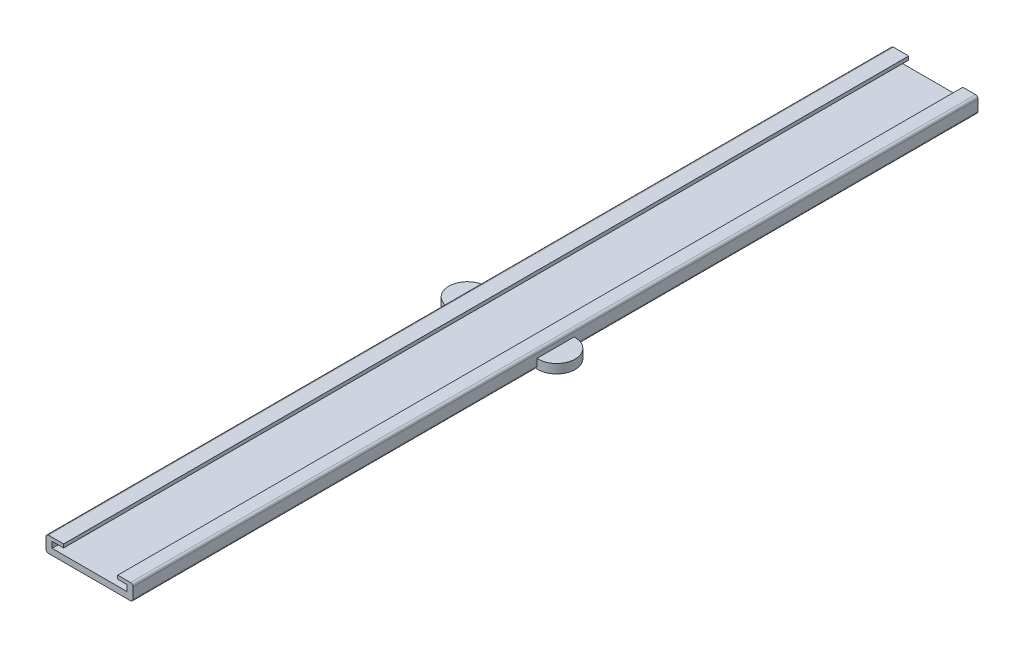
ISO-10303-21;
HEADER;
FILE_DESCRIPTION(('STEP AP214'),'2;1');
FILE_NAME('part.step','',(''),(''),'','','');
FILE_SCHEMA(('AUTOMOTIVE_DESIGN { 1 0 10303 214 1 1 1 1 }'));
ENDSEC;
DATA;
#1=APPLICATION_CONTEXT('core data for automotive mechanical design processes');
#2=APPLICATION_PROTOCOL_DEFINITION('international standard','automotive_design',2000,#1);
#3=PRODUCT_CONTEXT('',#1,'mechanical');
#4=PRODUCT('Part','Part','',(#3));
#5=PRODUCT_RELATED_PRODUCT_CATEGORY('part','',(#4));
#6=PRODUCT_DEFINITION_FORMATION('','',#4);
#7=PRODUCT_DEFINITION_CONTEXT('part definition',#1,'design');
#8=PRODUCT_DEFINITION('design','',#6,#7);
#9=PRODUCT_DEFINITION_SHAPE('','',#8);
#10=(LENGTH_UNIT() NAMED_UNIT(*) SI_UNIT(.MILLI.,.METRE.));
#11=(NAMED_UNIT(*) PLANE_ANGLE_UNIT() SI_UNIT($,.RADIAN.));
#12=(NAMED_UNIT(*) SI_UNIT($,.STERADIAN.) SOLID_ANGLE_UNIT());
#13=UNCERTAINTY_MEASURE_WITH_UNIT(LENGTH_MEASURE(1.E-05),#10,'distance_accuracy_value','');
#14=(GEOMETRIC_REPRESENTATION_CONTEXT(3) GLOBAL_UNCERTAINTY_ASSIGNED_CONTEXT((#13)) GLOBAL_UNIT_ASSIGNED_CONTEXT((#10,
#11,#12)) REPRESENTATION_CONTEXT('',''));
#15=CARTESIAN_POINT('',(0.,0.,0.));
#16=DIRECTION('',(0.,0.,1.));
#17=DIRECTION('',(1.,0.,0.));
#18=AXIS2_PLACEMENT_3D('',#15,#16,#17);
#19=CARTESIAN_POINT('',(-8.5725,0.508000000000008,-176.53));
#20=DIRECTION('',(0.,0.,1.));
#21=DIRECTION('',(1.,0.,0.));
#22=AXIS2_PLACEMENT_3D('',#19,#20,#21);
#23=CYLINDRICAL_SURFACE('',#22,0.508);
#24=CARTESIAN_POINT('',(-8.5725,0.,-84.455));
#25=CARTESIAN_POINT('',(-8.60085601750361,-2.57363729660605E-05,-84.4494803566917));
#26=CARTESIAN_POINT('',(-8.62928075324016,0.00237318987759572,-84.4443009230305));
#27=CARTESIAN_POINT('',(-8.68544702799154,0.0119040517791768,-84.4346899525163));
#28=CARTESIAN_POINT('',(-8.71318874184507,0.019034762853893,-84.4302582225313));
#29=CARTESIAN_POINT('',(-8.76721096384297,0.0379224635732551,-84.4222031700812));
#30=CARTESIAN_POINT('',(-8.79348997663773,0.0496840918321696,-84.4185806639051));
#31=CARTESIAN_POINT('',(-8.84374859544451,0.0775205499635421,-84.4121340674472));
#32=CARTESIAN_POINT('',(-8.86772915073191,0.0935935886905984,-84.4093096466046));
#33=CARTESIAN_POINT('',(-8.91240699002651,0.129400617523507,-84.404419715912));
#34=CARTESIAN_POINT('',(-8.9331391302894,0.149089982047235,-84.4023457834776));
#35=CARTESIAN_POINT('',(-8.97103758556271,0.191701373107937,-84.3988116410205));
#36=CARTESIAN_POINT('',(-8.9882030543511,0.214624164641076,-84.397351576559));
#37=CARTESIAN_POINT('',(-9.01839309631914,0.262944704366066,-84.3949392911666));
#38=CARTESIAN_POINT('',(-9.0314338201598,0.288332277738446,-84.3939850793579));
#39=CARTESIAN_POINT('',(-9.05308403224343,0.340934990054207,-84.3924741392716));
#40=CARTESIAN_POINT('',(-9.0616961075386,0.368149051502165,-84.3919171788606));
#41=CARTESIAN_POINT('',(-9.07213488865569,0.414269860246629,-84.3912583819337));
#42=CARTESIAN_POINT('',(-9.07526976471144,0.432889921611696,-84.3910664573951));
#43=CARTESIAN_POINT('',(-9.0794521411264,0.470337421251989,-84.3908134968995));
#44=CARTESIAN_POINT('',(-9.08050255915455,0.489164532518518,-84.3907522779813));
#45=CARTESIAN_POINT('',(-9.0805,0.508000000000008,-84.3907507825649));
#46=B_SPLINE_CURVE_WITH_KNOTS('',3,(#24,#25,#26,#27,#28,#29,#30,#31,#32,#33,#34,#35,#36,#37,#38,
#39,#40,#41,#42,#43,#44,#45),.UNSPECIFIED.,.F.,.F.,(4,2,2,2,2,2,2,2,2,2,4),(0.,
0.0865671762193437,0.173111957762147,0.25974364937724,0.34633940605287,0.431930743014866,
0.517542364093426,0.602814495073263,0.688036756488799,0.744576722813288,0.801037492728107),.UNSPECIFIED.);
#47=CARTESIAN_POINT('',(-8.57250000000001,0.,-84.455));
#48=VERTEX_POINT('',#47);
#49=CARTESIAN_POINT('',(-9.0805,0.508000000000008,-84.3907507825649));
#50=VERTEX_POINT('',#49);
#51=EDGE_CURVE('E199',#48,#50,#46,.T.);
#52=ORIENTED_EDGE('',*,*,#51,.F.);
#53=DIRECTION('',(0.,0.,1.));
#54=VECTOR('',#53,1.);
#55=CARTESIAN_POINT('',(-8.5725,0.,-176.53));
#56=LINE('',#55,#54);
#57=CARTESIAN_POINT('',(-8.5725,0.,0.));
#58=VERTEX_POINT('',#57);
#59=EDGE_CURVE('E209',#48,#58,#56,.T.);
#60=ORIENTED_EDGE('',*,*,#59,.T.);
#61=CARTESIAN_POINT('',(-8.5725,0.508000000000008,0.));
#62=DIRECTION('',(0.,0.,1.));
#63=DIRECTION('',(-1.,0.,0.));
#64=AXIS2_PLACEMENT_3D('',#61,#62,#63);
#65=CIRCLE('',#64,0.508);
#66=CARTESIAN_POINT('',(-9.0805,0.508000000000008,0.));
#67=VERTEX_POINT('',#66);
#68=EDGE_CURVE('E339',#67,#58,#65,.T.);
#69=ORIENTED_EDGE('',*,*,#68,.F.);
#70=DIRECTION('',(0.,0.,1.));
#71=VECTOR('',#70,1.);
#72=CARTESIAN_POINT('',(-9.0805,0.508000000000008,-176.53));
#73=LINE('',#72,#71);
#74=EDGE_CURVE('E211',#50,#67,#73,.T.);
#75=ORIENTED_EDGE('',*,*,#74,.F.);
#76=EDGE_LOOP('',(#52,#60,#69,#75));
#77=FACE_BOUND('',#76,.T.);
#78=ADVANCED_FACE('F49',(#77),#23,.T.);
#79=CARTESIAN_POINT('',(9.0805,0.508000000000008,-176.53));
#80=DIRECTION('',(1.,0.,0.));
#81=DIRECTION('',(0.,0.,-1.));
#82=AXIS2_PLACEMENT_3D('',#79,#80,#81);
#83=PLANE('',#82);
#84=DIRECTION('',(0.,0.,1.));
#85=VECTOR('',#84,1.);
#86=CARTESIAN_POINT('',(9.0805,0.508000000000008,-176.53));
#87=LINE('',#86,#85);
#88=CARTESIAN_POINT('',(9.0805,0.508000000000008,-84.3907507825649));
#89=VERTEX_POINT('',#88);
#90=CARTESIAN_POINT('',(9.0805,0.508000000000008,0.));
#91=VERTEX_POINT('',#90);
#92=EDGE_CURVE('E381',#89,#91,#87,.T.);
#93=ORIENTED_EDGE('',*,*,#92,.F.);
#94=DIRECTION('',(0.,-1.,0.));
#95=VECTOR('',#94,1.);
#96=CARTESIAN_POINT('',(9.0805,1.90499999999999,-84.3907507825649));
#97=LINE('',#96,#95);
#98=CARTESIAN_POINT('',(9.0805,1.90499999999999,-84.3907507825649));
#99=VERTEX_POINT('',#98);
#100=EDGE_CURVE('E422',#89,#99,#97,.F.);
#101=ORIENTED_EDGE('',*,*,#100,.T.);
#102=DIRECTION('',(0.,0.,-1.));
#103=VECTOR('',#102,1.);
#104=CARTESIAN_POINT('',(9.0805,1.90499999999999,-176.53));
#105=LINE('',#104,#103);
#106=CARTESIAN_POINT('',(9.0805,1.90499999999999,-92.1392492174351));
#107=VERTEX_POINT('',#106);
#108=EDGE_CURVE('E238',#99,#107,#105,.T.);
#109=ORIENTED_EDGE('',*,*,#108,.T.);
#110=DIRECTION('',(0.,-1.,0.));
#111=VECTOR('',#110,1.);
#112=CARTESIAN_POINT('',(9.0805,1.90499999999999,-92.1392492174351));
#113=LINE('',#112,#111);
#114=CARTESIAN_POINT('',(9.0805,0.508000000000008,-92.1392492174351));
#115=VERTEX_POINT('',#114);
#116=EDGE_CURVE('E324',#107,#115,#113,.T.);
#117=ORIENTED_EDGE('',*,*,#116,.T.);
#118=CARTESIAN_POINT('',(9.0805,0.508000000000008,-176.53));
#119=VERTEX_POINT('',#118);
#120=EDGE_CURVE('E379',#119,#115,#87,.T.);
#121=ORIENTED_EDGE('',*,*,#120,.F.);
#122=DIRECTION('',(0.,1.,0.));
#123=VECTOR('',#122,1.);
#124=CARTESIAN_POINT('',(9.0805,0.508000000000008,-176.53));
#125=LINE('',#124,#123);
#126=CARTESIAN_POINT('',(9.0805,2.79399999999999,-176.53));
#127=VERTEX_POINT('',#126);
#128=EDGE_CURVE('E300',#119,#127,#125,.T.);
#129=ORIENTED_EDGE('',*,*,#128,.T.);
#130=DIRECTION('',(0.,0.,1.));
#131=VECTOR('',#130,1.);
#132=CARTESIAN_POINT('',(9.0805,2.79399999999999,-176.53));
#133=LINE('',#132,#131);
#134=CARTESIAN_POINT('',(9.0805,2.79399999999999,0.));
#135=VERTEX_POINT('',#134);
#136=EDGE_CURVE('E378',#127,#135,#133,.T.);
#137=ORIENTED_EDGE('',*,*,#136,.T.);
#138=DIRECTION('',(0.,1.,0.));
#139=VECTOR('',#138,1.);
#140=CARTESIAN_POINT('',(9.0805,0.508000000000008,0.));
#141=LINE('',#140,#139);
#142=EDGE_CURVE('E345',#91,#135,#141,.T.);
#143=ORIENTED_EDGE('',*,*,#142,.F.);
#144=EDGE_LOOP('',(#93,#101,#109,#117,#121,#129,#137,#143));
#145=FACE_BOUND('',#144,.T.);
#146=ADVANCED_FACE('F256',(#145),#83,.T.);
#147=CARTESIAN_POINT('',(8.5725,0.508000000000008,-176.53));
#148=DIRECTION('',(0.,0.,1.));
#149=DIRECTION('',(1.,0.,0.));
#150=AXIS2_PLACEMENT_3D('',#147,#148,#149);
#151=CYLINDRICAL_SURFACE('',#150,0.508);
#152=ORIENTED_EDGE('',*,*,#120,.T.);
#153=CARTESIAN_POINT('',(9.0805,0.508000000000008,-92.1392492174351));
#154=CARTESIAN_POINT('',(9.08052454050856,0.47948709235608,-92.1392417212356));
#155=CARTESIAN_POINT('',(9.07810091401542,0.450981072385935,-92.139105443856));
#156=CARTESIAN_POINT('',(9.06853771388,0.394795340657186,-92.1385198869864));
#157=CARTESIAN_POINT('',(9.06140162670704,0.367115033814449,-92.1380708388833));
#158=CARTESIAN_POINT('',(9.0425886415355,0.31333516747899,-92.1368041333826));
#159=CARTESIAN_POINT('',(9.03090944614668,0.287236415487662,-92.1359862894564));
#160=CARTESIAN_POINT('',(9.00335951362613,0.237381129190595,-92.1338842053361));
#161=CARTESIAN_POINT('',(8.98748956231524,0.213624156916645,-92.132600052564));
#162=CARTESIAN_POINT('',(8.95203778634441,0.169144216635002,-92.1294573325824));
#163=CARTESIAN_POINT('',(8.9324595473146,0.148418351804164,-92.1275993191667));
#164=CARTESIAN_POINT('',(8.89015796761817,0.110554235591045,-92.1232036356471));
#165=CARTESIAN_POINT('',(8.86743429633976,0.0934163618136529,-92.1206658940717));
#166=CARTESIAN_POINT('',(8.81953459375239,0.0632084453451852,-92.1148354139104));
#167=CARTESIAN_POINT('',(8.79435982876638,0.0501363166334418,-92.1115430640041));
#168=CARTESIAN_POINT('',(8.74228943665466,0.0283846951320433,-92.1041700640766));
#169=CARTESIAN_POINT('',(8.71539435316314,0.0197038223205138,-92.1000896622708));
#170=CARTESIAN_POINT('',(8.66904804631985,0.00887712465885759,-92.0925354137435));
#171=CARTESIAN_POINT('',(8.64983257459497,0.0055450682170126,-92.0892570318643));
#172=CARTESIAN_POINT('',(8.61123666689856,0.00110666177209787,-92.0823698460991));
#173=CARTESIAN_POINT('',(8.59185654382364,-3.23850493928589E-06,-92.0787615789228));
#174=CARTESIAN_POINT('',(8.57250000000001,0.,-92.075));
#175=B_SPLINE_CURVE_WITH_KNOTS('',3,(#153,#154,#155,#156,#157,#158,#159,#160,#161,#162,#163,
#164,#165,#166,#167,#168,#169,#170,#171,#172,#173,#174),.UNSPECIFIED.,.F.,.F.,(4,2,2,2,2,2,2,2,
2,2,4),(0.,0.0854257775274036,0.170788424304943,0.256194294087832,0.341584160525399,
0.426891879145785,0.512208571154461,0.597481417055752,0.682727447936928,0.741933414736251,
0.801044714167535),.UNSPECIFIED.);
#176=CARTESIAN_POINT('',(8.57250000000001,0.,-92.075));
#177=VERTEX_POINT('',#176);
#178=EDGE_CURVE('E414',#115,#177,#175,.T.);
#179=ORIENTED_EDGE('',*,*,#178,.T.);
#180=DIRECTION('',(0.,0.,1.));
#181=VECTOR('',#180,1.);
#182=CARTESIAN_POINT('',(8.5725,0.,-176.53));
#183=LINE('',#182,#181);
#184=CARTESIAN_POINT('',(8.5725,0.,-176.53));
#185=VERTEX_POINT('',#184);
#186=EDGE_CURVE('E224',#185,#177,#183,.T.);
#187=ORIENTED_EDGE('',*,*,#186,.F.);
#188=CARTESIAN_POINT('',(8.5725,0.508000000000008,-176.53));
#189=DIRECTION('',(0.,0.,1.));
#190=DIRECTION('',(-1.,0.,0.));
#191=AXIS2_PLACEMENT_3D('',#188,#189,#190);
#192=CIRCLE('',#191,0.508);
#193=EDGE_CURVE('E297',#185,#119,#192,.T.);
#194=ORIENTED_EDGE('',*,*,#193,.T.);
#195=EDGE_LOOP('',(#152,#179,#187,#194));
#196=FACE_BOUND('',#195,.T.);
#197=ADVANCED_FACE('F262',(#196),#151,.T.);
#198=CARTESIAN_POINT('',(8.5725,0.,-84.455));
#199=VERTEX_POINT('',#198);
#200=CARTESIAN_POINT('',(8.5725,0.,0.));
#201=VERTEX_POINT('',#200);
#202=EDGE_CURVE('E220',#199,#201,#183,.T.);
#203=ORIENTED_EDGE('',*,*,#202,.F.);
#204=CARTESIAN_POINT('',(8.5725,0.,-84.455));
#205=CARTESIAN_POINT('',(8.60085601750361,-2.57363729660605E-05,-84.4494803566917));
#206=CARTESIAN_POINT('',(8.62928075324016,0.00237318987759572,-84.4443009230305));
#207=CARTESIAN_POINT('',(8.68544702799154,0.0119040517791768,-84.4346899525163));
#208=CARTESIAN_POINT('',(8.71318874184507,0.019034762853893,-84.4302582225313));
#209=CARTESIAN_POINT('',(8.76721096384297,0.0379224635732551,-84.4222031700812));
#210=CARTESIAN_POINT('',(8.79348997663773,0.0496840918321696,-84.4185806639051));
#211=CARTESIAN_POINT('',(8.84374859544451,0.0775205499635421,-84.4121340674472));
#212=CARTESIAN_POINT('',(8.86772915073191,0.0935935886905984,-84.4093096466046));
#213=CARTESIAN_POINT('',(8.91240699002651,0.129400617523507,-84.404419715912));
#214=CARTESIAN_POINT('',(8.9331391302894,0.149089982047235,-84.4023457834776));
#215=CARTESIAN_POINT('',(8.97103758556271,0.191701373107937,-84.3988116410205));
#216=CARTESIAN_POINT('',(8.9882030543511,0.214624164641076,-84.397351576559));
#217=CARTESIAN_POINT('',(9.01839309631914,0.262944704366066,-84.3949392911666));
#218=CARTESIAN_POINT('',(9.0314338201598,0.288332277738446,-84.3939850793579));
#219=CARTESIAN_POINT('',(9.05308403224343,0.340934990054207,-84.3924741392716));
#220=CARTESIAN_POINT('',(9.0616961075386,0.368149051502165,-84.3919171788606));
#221=CARTESIAN_POINT('',(9.07213488865569,0.414269860246629,-84.3912583819337));
#222=CARTESIAN_POINT('',(9.07526976471144,0.432889921611696,-84.3910664573951));
#223=CARTESIAN_POINT('',(9.0794521411264,0.470337421251989,-84.3908134968995));
#224=CARTESIAN_POINT('',(9.08050255915455,0.489164532518518,-84.3907522779813));
#225=CARTESIAN_POINT('',(9.0805,0.508000000000008,-84.3907507825649));
#226=B_SPLINE_CURVE_WITH_KNOTS('',3,(#204,#205,#206,#207,#208,#209,#210,#211,#212,#213,#214,
#215,#216,#217,#218,#219,#220,#221,#222,#223,#224,#225),.UNSPECIFIED.,.F.,.F.,(4,2,2,2,2,2,2,2,
2,2,4),(0.,0.0865671762193437,0.173111957762147,0.25974364937724,0.34633940605287,
0.431930743014866,0.517542364093426,0.602814495073263,0.688036756488799,0.744576722813288,
0.801037492728107),.UNSPECIFIED.);
#227=EDGE_CURVE('E433',#199,#89,#226,.T.);
#228=ORIENTED_EDGE('',*,*,#227,.T.);
#229=ORIENTED_EDGE('',*,*,#92,.T.);
#230=CARTESIAN_POINT('',(8.5725,0.508000000000008,0.));
#231=DIRECTION('',(0.,0.,1.));
#232=DIRECTION('',(-1.,0.,0.));
#233=AXIS2_PLACEMENT_3D('',#230,#231,#232);
#234=CIRCLE('',#233,0.508);
#235=EDGE_CURVE('E342',#201,#91,#234,.T.);
#236=ORIENTED_EDGE('',*,*,#235,.F.);
#237=EDGE_LOOP('',(#203,#228,#229,#236));
#238=FACE_BOUND('',#237,.T.);
#239=ADVANCED_FACE('F390',(#238),#151,.T.);
#240=CARTESIAN_POINT('',(-7.8105,2.5654,-176.53));
#241=DIRECTION('',(1.,0.,0.));
#242=DIRECTION('',(0.,0.,-1.));
#243=AXIS2_PLACEMENT_3D('',#240,#241,#242);
#244=PLANE('',#243);
#245=DIRECTION('',(0.,1.,0.));
#246=VECTOR('',#245,1.);
#247=CARTESIAN_POINT('',(-7.8105,2.5654,0.));
#248=LINE('',#247,#246);
#249=CARTESIAN_POINT('',(-7.8105,1.2954,0.));
#250=VERTEX_POINT('',#249);
#251=CARTESIAN_POINT('',(-7.8105,2.5654,0.));
#252=VERTEX_POINT('',#251);
#253=EDGE_CURVE('E320',#250,#252,#248,.T.);
#254=ORIENTED_EDGE('',*,*,#253,.F.);
#255=DIRECTION('',(0.,0.,1.));
#256=VECTOR('',#255,1.);
#257=CARTESIAN_POINT('',(-7.8105,1.2954,-176.53));
#258=LINE('',#257,#256);
#259=CARTESIAN_POINT('',(-7.8105,1.2954,-176.53));
#260=VERTEX_POINT('',#259);
#261=EDGE_CURVE('E242',#260,#250,#258,.T.);
#262=ORIENTED_EDGE('',*,*,#261,.F.);
#263=DIRECTION('',(0.,1.,0.));
#264=VECTOR('',#263,1.);
#265=CARTESIAN_POINT('',(-7.8105,2.5654,-176.53));
#266=LINE('',#265,#264);
#267=CARTESIAN_POINT('',(-7.8105,2.5654,-176.53));
#268=VERTEX_POINT('',#267);
#269=EDGE_CURVE('E366',#260,#268,#266,.T.);
#270=ORIENTED_EDGE('',*,*,#269,.T.);
#271=DIRECTION('',(0.,0.,1.));
#272=VECTOR('',#271,1.);
#273=CARTESIAN_POINT('',(-7.8105,2.5654,-176.53));
#274=LINE('',#273,#272);
#275=EDGE_CURVE('E235',#268,#252,#274,.T.);
#276=ORIENTED_EDGE('',*,*,#275,.T.);
#277=EDGE_LOOP('',(#254,#262,#270,#276));
#278=FACE_BOUND('',#277,.T.);
#279=ADVANCED_FACE('F51',(#278),#244,.T.);
#280=CARTESIAN_POINT('',(-7.8105,1.2954,-176.53));
#281=DIRECTION('',(0.,1.,0.));
#282=DIRECTION('',(0.,0.,1.));
#283=AXIS2_PLACEMENT_3D('',#280,#281,#282);
#284=PLANE('',#283);
#285=DIRECTION('',(-1.,0.,0.));
#286=VECTOR('',#285,1.);
#287=CARTESIAN_POINT('',(-7.8105,1.2954,0.));
#288=LINE('',#287,#286);
#289=CARTESIAN_POINT('',(7.8105,1.2954,0.));
#290=VERTEX_POINT('',#289);
#291=EDGE_CURVE('E363',#290,#250,#288,.T.);
#292=ORIENTED_EDGE('',*,*,#291,.F.);
#293=DIRECTION('',(0.,0.,1.));
#294=VECTOR('',#293,1.);
#295=CARTESIAN_POINT('',(7.8105,1.2954,-176.53));
#296=LINE('',#295,#294);
#297=CARTESIAN_POINT('',(7.8105,1.2954,-176.53));
#298=VERTEX_POINT('',#297);
#299=EDGE_CURVE('E368',#298,#290,#296,.T.);
#300=ORIENTED_EDGE('',*,*,#299,.F.);
#301=DIRECTION('',(-1.,0.,0.));
#302=VECTOR('',#301,1.);
#303=CARTESIAN_POINT('',(-7.8105,1.2954,-176.53));
#304=LINE('',#303,#302);
#305=EDGE_CURVE('E237',#298,#260,#304,.T.);
#306=ORIENTED_EDGE('',*,*,#305,.T.);
#307=ORIENTED_EDGE('',*,*,#261,.T.);
#308=EDGE_LOOP('',(#292,#300,#306,#307));
#309=FACE_BOUND('',#308,.T.);
#310=ADVANCED_FACE('F478',(#309),#284,.T.);
#311=CARTESIAN_POINT('',(7.8105,1.2954,-176.53));
#312=DIRECTION('',(-1.,0.,0.));
#313=DIRECTION('',(0.,-1.,0.));
#314=AXIS2_PLACEMENT_3D('',#311,#312,#313);
#315=PLANE('',#314);
#316=DIRECTION('',(0.,-1.,0.));
#317=VECTOR('',#316,1.);
#318=CARTESIAN_POINT('',(7.8105,1.2954,0.));
#319=LINE('',#318,#317);
#320=CARTESIAN_POINT('',(7.8105,2.5654,0.));
#321=VERTEX_POINT('',#320);
#322=EDGE_CURVE('E360',#321,#290,#319,.T.);
#323=ORIENTED_EDGE('',*,*,#322,.F.);
#324=DIRECTION('',(0.,0.,1.));
#325=VECTOR('',#324,1.);
#326=CARTESIAN_POINT('',(7.8105,2.5654,-176.53));
#327=LINE('',#326,#325);
#328=CARTESIAN_POINT('',(7.8105,2.5654,-176.53));
#329=VERTEX_POINT('',#328);
#330=EDGE_CURVE('E370',#329,#321,#327,.T.);
#331=ORIENTED_EDGE('',*,*,#330,.F.);
#332=DIRECTION('',(0.,-1.,0.));
#333=VECTOR('',#332,1.);
#334=CARTESIAN_POINT('',(7.8105,1.2954,-176.53));
#335=LINE('',#334,#333);
#336=EDGE_CURVE('E315',#329,#298,#335,.T.);
#337=ORIENTED_EDGE('',*,*,#336,.T.);
#338=ORIENTED_EDGE('',*,*,#299,.T.);
#339=EDGE_LOOP('',(#323,#331,#337,#338));
#340=FACE_BOUND('',#339,.T.);
#341=ADVANCED_FACE('F490',(#340),#315,.T.);
#342=CARTESIAN_POINT('',(5.9055,2.5654,-176.53));
#343=DIRECTION('',(0.,-1.,0.));
#344=DIRECTION('',(1.,0.,0.));
#345=AXIS2_PLACEMENT_3D('',#342,#343,#344);
#346=PLANE('',#345);
#347=DIRECTION('',(1.,0.,0.));
#348=VECTOR('',#347,1.);
#349=CARTESIAN_POINT('',(5.9055,2.5654,0.));
#350=LINE('',#349,#348);
#351=CARTESIAN_POINT('',(5.9055,2.5654,0.));
#352=VERTEX_POINT('',#351);
#353=EDGE_CURVE('E357',#352,#321,#350,.T.);
#354=ORIENTED_EDGE('',*,*,#353,.F.);
#355=DIRECTION('',(0.,0.,1.));
#356=VECTOR('',#355,1.);
#357=CARTESIAN_POINT('',(5.9055,2.5654,-176.53));
#358=LINE('',#357,#356);
#359=CARTESIAN_POINT('',(5.9055,2.5654,-176.53));
#360=VERTEX_POINT('',#359);
#361=EDGE_CURVE('E372',#360,#352,#358,.T.);
#362=ORIENTED_EDGE('',*,*,#361,.F.);
#363=DIRECTION('',(1.,0.,0.));
#364=VECTOR('',#363,1.);
#365=CARTESIAN_POINT('',(5.9055,2.5654,-176.53));
#366=LINE('',#365,#364);
#367=EDGE_CURVE('E312',#360,#329,#366,.T.);
#368=ORIENTED_EDGE('',*,*,#367,.T.);
#369=ORIENTED_EDGE('',*,*,#330,.T.);
#370=EDGE_LOOP('',(#354,#362,#368,#369));
#371=FACE_BOUND('',#370,.T.);
#372=ADVANCED_FACE('F473',(#371),#346,.T.);
#373=CARTESIAN_POINT('',(5.9055,3.302,-176.53));
#374=DIRECTION('',(-1.,0.,0.));
#375=DIRECTION('',(0.,-1.,0.));
#376=AXIS2_PLACEMENT_3D('',#373,#374,#375);
#377=PLANE('',#376);
#378=DIRECTION('',(0.,-1.,0.));
#379=VECTOR('',#378,1.);
#380=CARTESIAN_POINT('',(5.9055,3.302,0.));
#381=LINE('',#380,#379);
#382=CARTESIAN_POINT('',(5.9055,3.302,0.));
#383=VERTEX_POINT('',#382);
#384=EDGE_CURVE('E354',#383,#352,#381,.T.);
#385=ORIENTED_EDGE('',*,*,#384,.F.);
#386=DIRECTION('',(0.,0.,1.));
#387=VECTOR('',#386,1.);
#388=CARTESIAN_POINT('',(5.9055,3.302,-176.53));
#389=LINE('',#388,#387);
#390=CARTESIAN_POINT('',(5.9055,3.302,-176.53));
#391=VERTEX_POINT('',#390);
#392=EDGE_CURVE('E374',#391,#383,#389,.T.);
#393=ORIENTED_EDGE('',*,*,#392,.F.);
#394=DIRECTION('',(0.,-1.,0.));
#395=VECTOR('',#394,1.);
#396=CARTESIAN_POINT('',(5.9055,3.302,-176.53));
#397=LINE('',#396,#395);
#398=EDGE_CURVE('E309',#391,#360,#397,.T.);
#399=ORIENTED_EDGE('',*,*,#398,.T.);
#400=ORIENTED_EDGE('',*,*,#361,.T.);
#401=EDGE_LOOP('',(#385,#393,#399,#400));
#402=FACE_BOUND('',#401,.T.);
#403=ADVANCED_FACE('F469',(#402),#377,.T.);
#404=CARTESIAN_POINT('',(8.5725,3.302,-176.53));
#405=DIRECTION('',(0.,1.,0.));
#406=DIRECTION('',(0.,0.,1.));
#407=AXIS2_PLACEMENT_3D('',#404,#405,#406);
#408=PLANE('',#407);
#409=DIRECTION('',(-1.,0.,0.));
#410=VECTOR('',#409,1.);
#411=CARTESIAN_POINT('',(8.5725,3.302,0.));
#412=LINE('',#411,#410);
#413=CARTESIAN_POINT('',(8.5725,3.302,0.));
#414=VERTEX_POINT('',#413);
#415=EDGE_CURVE('E351',#414,#383,#412,.T.);
#416=ORIENTED_EDGE('',*,*,#415,.F.);
#417=DIRECTION('',(0.,0.,1.));
#418=VECTOR('',#417,1.);
#419=CARTESIAN_POINT('',(8.5725,3.302,-176.53));
#420=LINE('',#419,#418);
#421=CARTESIAN_POINT('',(8.5725,3.302,-176.53));
#422=VERTEX_POINT('',#421);
#423=EDGE_CURVE('E376',#422,#414,#420,.T.);
#424=ORIENTED_EDGE('',*,*,#423,.F.);
#425=DIRECTION('',(-1.,0.,0.));
#426=VECTOR('',#425,1.);
#427=CARTESIAN_POINT('',(8.5725,3.302,-176.53));
#428=LINE('',#427,#426);
#429=EDGE_CURVE('E306',#422,#391,#428,.T.);
#430=ORIENTED_EDGE('',*,*,#429,.T.);
#431=ORIENTED_EDGE('',*,*,#392,.T.);
#432=EDGE_LOOP('',(#416,#424,#430,#431));
#433=FACE_BOUND('',#432,.T.);
#434=ADVANCED_FACE('F466',(#433),#408,.T.);
#435=CARTESIAN_POINT('',(8.5725,2.79399999999999,-176.53));
#436=DIRECTION('',(0.,0.,1.));
#437=DIRECTION('',(1.,0.,0.));
#438=AXIS2_PLACEMENT_3D('',#435,#436,#437);
#439=CYLINDRICAL_SURFACE('',#438,0.508);
#440=CARTESIAN_POINT('',(8.5725,2.79399999999999,0.));
#441=DIRECTION('',(0.,0.,1.));
#442=DIRECTION('',(1.,0.,0.));
#443=AXIS2_PLACEMENT_3D('',#440,#441,#442);
#444=CIRCLE('',#443,0.508);
#445=EDGE_CURVE('E348',#135,#414,#444,.T.);
#446=ORIENTED_EDGE('',*,*,#445,.F.);
#447=ORIENTED_EDGE('',*,*,#136,.F.);
#448=CARTESIAN_POINT('',(8.5725,2.79399999999999,-176.53));
#449=DIRECTION('',(0.,0.,1.));
#450=DIRECTION('',(1.,0.,0.));
#451=AXIS2_PLACEMENT_3D('',#448,#449,#450);
#452=CIRCLE('',#451,0.508);
#453=EDGE_CURVE('E303',#127,#422,#452,.T.);
#454=ORIENTED_EDGE('',*,*,#453,.T.);
#455=ORIENTED_EDGE('',*,*,#423,.T.);
#456=EDGE_LOOP('',(#446,#447,#454,#455));
#457=FACE_BOUND('',#456,.T.);
#458=ADVANCED_FACE('F275',(#457),#439,.T.);
#459=CARTESIAN_POINT('',(-8.5725,0.,-176.53));
#460=DIRECTION('',(0.,-1.,0.));
#461=DIRECTION('',(1.,0.,0.));
#462=AXIS2_PLACEMENT_3D('',#459,#460,#461);
#463=PLANE('',#462);
#464=DIRECTION('',(1.,0.,0.));
#465=VECTOR('',#464,1.);
#466=CARTESIAN_POINT('',(-8.5725,0.,0.));
#467=LINE('',#466,#465);
#468=EDGE_CURVE('E215',#58,#201,#467,.T.);
#469=ORIENTED_EDGE('',*,*,#468,.F.);
#470=ORIENTED_EDGE('',*,*,#59,.F.);
#471=CARTESIAN_POINT('',(-9.31243208542951,0.,-88.265));
#472=DIRECTION('',(0.,-1.,0.));
#473=DIRECTION('',(0.,0.,-1.));
#474=AXIS2_PLACEMENT_3D('',#471,#472,#473);
#475=CIRCLE('',#474,3.88118532036902);
#476=CARTESIAN_POINT('',(-8.57250000000001,0.,-92.075));
#477=VERTEX_POINT('',#476);
#478=EDGE_CURVE('E196',#48,#477,#475,.T.);
#479=ORIENTED_EDGE('',*,*,#478,.T.);
#480=CARTESIAN_POINT('',(-8.5725,0.,-176.53));
#481=VERTEX_POINT('',#480);
#482=EDGE_CURVE('E217',#481,#477,#56,.T.);
#483=ORIENTED_EDGE('',*,*,#482,.F.);
#484=DIRECTION('',(1.,0.,0.));
#485=VECTOR('',#484,1.);
#486=CARTESIAN_POINT('',(-8.5725,0.,-176.53));
#487=LINE('',#486,#485);
#488=EDGE_CURVE('E289',#481,#185,#487,.T.);
#489=ORIENTED_EDGE('',*,*,#488,.T.);
#490=ORIENTED_EDGE('',*,*,#186,.T.);
#491=CARTESIAN_POINT('',(9.31243208542951,0.,-88.265));
#492=DIRECTION('',(0.,1.,0.));
#493=DIRECTION('',(0.,0.,-1.));
#494=AXIS2_PLACEMENT_3D('',#491,#492,#493);
#495=CIRCLE('',#494,3.88118532036902);
#496=EDGE_CURVE('E71',#199,#177,#495,.T.);
#497=ORIENTED_EDGE('',*,*,#496,.F.);
#498=ORIENTED_EDGE('',*,*,#202,.T.);
#499=EDGE_LOOP('',(#469,#470,#479,#483,#489,#490,#497,#498));
#500=FACE_BOUND('',#499,.T.);
#501=ADVANCED_FACE('F213',(#500),#463,.T.);
#502=CARTESIAN_POINT('',(-9.0805,0.508000000000008,-92.1392492174351));
#503=CARTESIAN_POINT('',(-9.08052454050856,0.47948709235608,-92.1392417212356));
#504=CARTESIAN_POINT('',(-9.07810091401542,0.450981072385935,-92.139105443856));
#505=CARTESIAN_POINT('',(-9.06853771388,0.394795340657186,-92.1385198869864));
#506=CARTESIAN_POINT('',(-9.06140162670704,0.367115033814449,-92.1380708388833));
#507=CARTESIAN_POINT('',(-9.0425886415355,0.31333516747899,-92.1368041333826));
#508=CARTESIAN_POINT('',(-9.03090944614668,0.287236415487662,-92.1359862894564));
#509=CARTESIAN_POINT('',(-9.00335951362613,0.237381129190595,-92.1338842053361));
#510=CARTESIAN_POINT('',(-8.98748956231524,0.213624156916645,-92.132600052564));
#511=CARTESIAN_POINT('',(-8.95203778634441,0.169144216635002,-92.1294573325824));
#512=CARTESIAN_POINT('',(-8.9324595473146,0.148418351804164,-92.1275993191667));
#513=CARTESIAN_POINT('',(-8.89015796761817,0.110554235591045,-92.1232036356471));
#514=CARTESIAN_POINT('',(-8.86743429633976,0.0934163618136529,-92.1206658940717));
#515=CARTESIAN_POINT('',(-8.81953459375239,0.0632084453451852,-92.1148354139104));
#516=CARTESIAN_POINT('',(-8.79435982876638,0.0501363166334418,-92.1115430640041));
#517=CARTESIAN_POINT('',(-8.74228943665466,0.0283846951320433,-92.1041700640766));
#518=CARTESIAN_POINT('',(-8.71539435316314,0.0197038223205138,-92.1000896622708));
#519=CARTESIAN_POINT('',(-8.66904804631985,0.00887712465885734,-92.0925354137435));
#520=CARTESIAN_POINT('',(-8.64983257459496,0.00554506821701222,-92.0892570318643));
#521=CARTESIAN_POINT('',(-8.61123666689856,0.00110666177209749,-92.0823698460991));
#522=CARTESIAN_POINT('',(-8.59185654382364,-3.23850493953839E-06,-92.0787615789228));
#523=CARTESIAN_POINT('',(-8.5725,0.,-92.075));
#524=B_SPLINE_CURVE_WITH_KNOTS('',3,(#502,#503,#504,#505,#506,#507,#508,#509,#510,#511,#512,
#513,#514,#515,#516,#517,#518,#519,#520,#521,#522,#523),.UNSPECIFIED.,.F.,.F.,(4,2,2,2,2,2,2,2,
2,2,4),(0.,0.0854257775274036,0.170788424304943,0.256194294087832,0.341584160525399,
0.426891879145785,0.512208571154461,0.597481417055752,0.682727447936928,0.741933414736255,
0.801044714167542),.UNSPECIFIED.);
#525=CARTESIAN_POINT('',(-9.0805,0.508000000000008,-92.1392492174351));
#526=VERTEX_POINT('',#525);
#527=EDGE_CURVE('E202',#526,#477,#524,.T.);
#528=ORIENTED_EDGE('',*,*,#527,.F.);
#529=CARTESIAN_POINT('',(-9.0805,0.508000000000008,-176.53));
#530=VERTEX_POINT('',#529);
#531=EDGE_CURVE('E218',#530,#526,#73,.T.);
#532=ORIENTED_EDGE('',*,*,#531,.F.);
#533=CARTESIAN_POINT('',(-8.5725,0.508000000000008,-176.53));
#534=DIRECTION('',(0.,0.,1.));
#535=DIRECTION('',(-1.,0.,0.));
#536=AXIS2_PLACEMENT_3D('',#533,#534,#535);
#537=CIRCLE('',#536,0.508);
#538=EDGE_CURVE('E286',#530,#481,#537,.T.);
#539=ORIENTED_EDGE('',*,*,#538,.T.);
#540=ORIENTED_EDGE('',*,*,#482,.T.);
#541=EDGE_LOOP('',(#528,#532,#539,#540));
#542=FACE_BOUND('',#541,.T.);
#543=ADVANCED_FACE('F258',(#542),#23,.T.);
#544=CARTESIAN_POINT('',(-9.0805,0.508000000000008,-176.53));
#545=DIRECTION('',(-1.,0.,0.));
#546=DIRECTION('',(0.,0.,1.));
#547=AXIS2_PLACEMENT_3D('',#544,#545,#546);
#548=PLANE('',#547);
#549=DIRECTION('',(0.,-1.,0.));
#550=VECTOR('',#549,1.);
#551=CARTESIAN_POINT('',(-9.0805,1.90499999999999,-92.1392492174351));
#552=LINE('',#551,#550);
#553=CARTESIAN_POINT('',(-9.0805,1.90499999999999,-92.1392492174351));
#554=VERTEX_POINT('',#553);
#555=EDGE_CURVE('E13',#554,#526,#552,.T.);
#556=ORIENTED_EDGE('',*,*,#555,.F.);
#557=DIRECTION('',(0.,0.,1.));
#558=VECTOR('',#557,1.);
#559=CARTESIAN_POINT('',(-9.0805,1.90499999999999,-176.53));
#560=LINE('',#559,#558);
#561=CARTESIAN_POINT('',(-9.0805,1.90499999999999,-84.3907507825649));
#562=VERTEX_POINT('',#561);
#563=EDGE_CURVE('E241',#554,#562,#560,.T.);
#564=ORIENTED_EDGE('',*,*,#563,.T.);
#565=DIRECTION('',(0.,-1.,0.));
#566=VECTOR('',#565,1.);
#567=CARTESIAN_POINT('',(-9.0805,1.90499999999999,-84.3907507825649));
#568=LINE('',#567,#566);
#569=EDGE_CURVE('E57',#50,#562,#568,.F.);
#570=ORIENTED_EDGE('',*,*,#569,.F.);
#571=ORIENTED_EDGE('',*,*,#74,.T.);
#572=DIRECTION('',(0.,-1.,0.));
#573=VECTOR('',#572,1.);
#574=CARTESIAN_POINT('',(-9.0805,0.508000000000008,0.));
#575=LINE('',#574,#573);
#576=CARTESIAN_POINT('',(-9.0805,2.79399999999999,0.));
#577=VERTEX_POINT('',#576);
#578=EDGE_CURVE('E336',#577,#67,#575,.T.);
#579=ORIENTED_EDGE('',*,*,#578,.F.);
#580=DIRECTION('',(0.,0.,1.));
#581=VECTOR('',#580,1.);
#582=CARTESIAN_POINT('',(-9.0805,2.79399999999999,-176.53));
#583=LINE('',#582,#581);
#584=CARTESIAN_POINT('',(-9.0805,2.79399999999999,-176.53));
#585=VERTEX_POINT('',#584);
#586=EDGE_CURVE('E227',#585,#577,#583,.T.);
#587=ORIENTED_EDGE('',*,*,#586,.F.);
#588=DIRECTION('',(0.,-1.,0.));
#589=VECTOR('',#588,1.);
#590=CARTESIAN_POINT('',(-9.0805,0.508000000000008,-176.53));
#591=LINE('',#590,#589);
#592=EDGE_CURVE('E281',#585,#530,#591,.T.);
#593=ORIENTED_EDGE('',*,*,#592,.T.);
#594=ORIENTED_EDGE('',*,*,#531,.T.);
#595=EDGE_LOOP('',(#556,#564,#570,#571,#579,#587,#593,#594));
#596=FACE_BOUND('',#595,.T.);
#597=ADVANCED_FACE('F246',(#596),#548,.T.);
#598=CARTESIAN_POINT('',(-8.5725,2.79399999999999,-176.53));
#599=DIRECTION('',(0.,0.,1.));
#600=DIRECTION('',(1.,0.,0.));
#601=AXIS2_PLACEMENT_3D('',#598,#599,#600);
#602=CYLINDRICAL_SURFACE('',#601,0.508);
#603=CARTESIAN_POINT('',(-8.5725,2.79399999999999,0.));
#604=DIRECTION('',(0.,0.,1.));
#605=DIRECTION('',(-1.,0.,0.));
#606=AXIS2_PLACEMENT_3D('',#603,#604,#605);
#607=CIRCLE('',#606,0.508);
#608=CARTESIAN_POINT('',(-8.5725,3.302,0.));
#609=VERTEX_POINT('',#608);
#610=EDGE_CURVE('E333',#609,#577,#607,.T.);
#611=ORIENTED_EDGE('',*,*,#610,.F.);
#612=DIRECTION('',(0.,0.,1.));
#613=VECTOR('',#612,1.);
#614=CARTESIAN_POINT('',(-8.5725,3.302,-176.53));
#615=LINE('',#614,#613);
#616=CARTESIAN_POINT('',(-8.5725,3.302,-176.53));
#617=VERTEX_POINT('',#616);
#618=EDGE_CURVE('E229',#617,#609,#615,.T.);
#619=ORIENTED_EDGE('',*,*,#618,.F.);
#620=CARTESIAN_POINT('',(-8.5725,2.79399999999999,-176.53));
#621=DIRECTION('',(0.,0.,1.));
#622=DIRECTION('',(-1.,0.,0.));
#623=AXIS2_PLACEMENT_3D('',#620,#621,#622);
#624=CIRCLE('',#623,0.508);
#625=EDGE_CURVE('E287',#617,#585,#624,.T.);
#626=ORIENTED_EDGE('',*,*,#625,.T.);
#627=ORIENTED_EDGE('',*,*,#586,.T.);
#628=EDGE_LOOP('',(#611,#619,#626,#627));
#629=FACE_BOUND('',#628,.T.);
#630=ADVANCED_FACE('F274',(#629),#602,.T.);
#631=CARTESIAN_POINT('',(-8.5725,3.302,-176.53));
#632=DIRECTION('',(0.,1.,0.));
#633=DIRECTION('',(-1.,0.,0.));
#634=AXIS2_PLACEMENT_3D('',#631,#632,#633);
#635=PLANE('',#634);
#636=DIRECTION('',(-1.,0.,0.));
#637=VECTOR('',#636,1.);
#638=CARTESIAN_POINT('',(-8.5725,3.302,0.));
#639=LINE('',#638,#637);
#640=CARTESIAN_POINT('',(-5.3975,3.302,0.));
#641=VERTEX_POINT('',#640);
#642=EDGE_CURVE('E330',#641,#609,#639,.T.);
#643=ORIENTED_EDGE('',*,*,#642,.F.);
#644=DIRECTION('',(0.,0.,1.));
#645=VECTOR('',#644,1.);
#646=CARTESIAN_POINT('',(-5.3975,3.302,-176.53));
#647=LINE('',#646,#645);
#648=CARTESIAN_POINT('',(-5.3975,3.302,-176.53));
#649=VERTEX_POINT('',#648);
#650=EDGE_CURVE('E231',#649,#641,#647,.T.);
#651=ORIENTED_EDGE('',*,*,#650,.F.);
#652=DIRECTION('',(-1.,0.,0.));
#653=VECTOR('',#652,1.);
#654=CARTESIAN_POINT('',(-8.5725,3.302,-176.53));
#655=LINE('',#654,#653);
#656=EDGE_CURVE('E291',#649,#617,#655,.T.);
#657=ORIENTED_EDGE('',*,*,#656,.T.);
#658=ORIENTED_EDGE('',*,*,#618,.T.);
#659=EDGE_LOOP('',(#643,#651,#657,#658));
#660=FACE_BOUND('',#659,.T.);
#661=ADVANCED_FACE('F403',(#660),#635,.T.);
#662=CARTESIAN_POINT('',(-5.3975,3.302,-176.53));
#663=DIRECTION('',(1.,0.,0.));
#664=DIRECTION('',(0.,1.,0.));
#665=AXIS2_PLACEMENT_3D('',#662,#663,#664);
#666=PLANE('',#665);
#667=DIRECTION('',(0.,1.,0.));
#668=VECTOR('',#667,1.);
#669=CARTESIAN_POINT('',(-5.3975,3.302,0.));
#670=LINE('',#669,#668);
#671=CARTESIAN_POINT('',(-5.3975,2.5654,0.));
#672=VERTEX_POINT('',#671);
#673=EDGE_CURVE('E327',#672,#641,#670,.T.);
#674=ORIENTED_EDGE('',*,*,#673,.F.);
#675=DIRECTION('',(0.,0.,1.));
#676=VECTOR('',#675,1.);
#677=CARTESIAN_POINT('',(-5.3975,2.5654,-176.53));
#678=LINE('',#677,#676);
#679=CARTESIAN_POINT('',(-5.3975,2.5654,-176.53));
#680=VERTEX_POINT('',#679);
#681=EDGE_CURVE('E233',#680,#672,#678,.T.);
#682=ORIENTED_EDGE('',*,*,#681,.F.);
#683=DIRECTION('',(0.,1.,0.));
#684=VECTOR('',#683,1.);
#685=CARTESIAN_POINT('',(-5.3975,3.302,-176.53));
#686=LINE('',#685,#684);
#687=EDGE_CURVE('E404',#680,#649,#686,.T.);
#688=ORIENTED_EDGE('',*,*,#687,.T.);
#689=ORIENTED_EDGE('',*,*,#650,.T.);
#690=EDGE_LOOP('',(#674,#682,#688,#689));
#691=FACE_BOUND('',#690,.T.);
#692=ADVANCED_FACE('F488',(#691),#666,.T.);
#693=CARTESIAN_POINT('',(-5.3975,2.5654,-176.53));
#694=DIRECTION('',(0.,-1.,0.));
#695=DIRECTION('',(0.,0.,-1.));
#696=AXIS2_PLACEMENT_3D('',#693,#694,#695);
#697=PLANE('',#696);
#698=DIRECTION('',(1.,0.,0.));
#699=VECTOR('',#698,1.);
#700=CARTESIAN_POINT('',(-5.3975,2.5654,0.));
#701=LINE('',#700,#699);
#702=EDGE_CURVE('E323',#252,#672,#701,.T.);
#703=ORIENTED_EDGE('',*,*,#702,.F.);
#704=ORIENTED_EDGE('',*,*,#275,.F.);
#705=DIRECTION('',(1.,0.,0.));
#706=VECTOR('',#705,1.);
#707=CARTESIAN_POINT('',(-5.3975,2.5654,-176.53));
#708=LINE('',#707,#706);
#709=EDGE_CURVE('E405',#268,#680,#708,.T.);
#710=ORIENTED_EDGE('',*,*,#709,.T.);
#711=ORIENTED_EDGE('',*,*,#681,.T.);
#712=EDGE_LOOP('',(#703,#704,#710,#711));
#713=FACE_BOUND('',#712,.T.);
#714=ADVANCED_FACE('F485',(#713),#697,.T.);
#715=CARTESIAN_POINT('',(8.5725,2.79399999999999,-176.53));
#716=DIRECTION('',(0.,0.,1.));
#717=DIRECTION('',(1.,0.,0.));
#718=AXIS2_PLACEMENT_3D('',#715,#716,#717);
#719=PLANE('',#718);
#720=ORIENTED_EDGE('',*,*,#269,.F.);
#721=ORIENTED_EDGE('',*,*,#305,.F.);
#722=ORIENTED_EDGE('',*,*,#336,.F.);
#723=ORIENTED_EDGE('',*,*,#367,.F.);
#724=ORIENTED_EDGE('',*,*,#398,.F.);
#725=ORIENTED_EDGE('',*,*,#429,.F.);
#726=ORIENTED_EDGE('',*,*,#453,.F.);
#727=ORIENTED_EDGE('',*,*,#128,.F.);
#728=ORIENTED_EDGE('',*,*,#193,.F.);
#729=ORIENTED_EDGE('',*,*,#488,.F.);
#730=ORIENTED_EDGE('',*,*,#538,.F.);
#731=ORIENTED_EDGE('',*,*,#592,.F.);
#732=ORIENTED_EDGE('',*,*,#625,.F.);
#733=ORIENTED_EDGE('',*,*,#656,.F.);
#734=ORIENTED_EDGE('',*,*,#687,.F.);
#735=ORIENTED_EDGE('',*,*,#709,.F.);
#736=EDGE_LOOP('',(#720,#721,#722,#723,#724,#725,#726,#727,#728,#729,#730,#731,#732,#733,#734,#735));
#737=FACE_BOUND('',#736,.T.);
#738=ADVANCED_FACE('F399',(#737),#719,.F.);
#739=CARTESIAN_POINT('',(8.5725,2.79399999999999,0.));
#740=DIRECTION('',(0.,0.,1.));
#741=DIRECTION('',(1.,0.,0.));
#742=AXIS2_PLACEMENT_3D('',#739,#740,#741);
#743=PLANE('',#742);
#744=ORIENTED_EDGE('',*,*,#253,.T.);
#745=ORIENTED_EDGE('',*,*,#702,.T.);
#746=ORIENTED_EDGE('',*,*,#673,.T.);
#747=ORIENTED_EDGE('',*,*,#642,.T.);
#748=ORIENTED_EDGE('',*,*,#610,.T.);
#749=ORIENTED_EDGE('',*,*,#578,.T.);
#750=ORIENTED_EDGE('',*,*,#68,.T.);
#751=ORIENTED_EDGE('',*,*,#468,.T.);
#752=ORIENTED_EDGE('',*,*,#235,.T.);
#753=ORIENTED_EDGE('',*,*,#142,.T.);
#754=ORIENTED_EDGE('',*,*,#445,.T.);
#755=ORIENTED_EDGE('',*,*,#415,.T.);
#756=ORIENTED_EDGE('',*,*,#384,.T.);
#757=ORIENTED_EDGE('',*,*,#353,.T.);
#758=ORIENTED_EDGE('',*,*,#322,.T.);
#759=ORIENTED_EDGE('',*,*,#291,.T.);
#760=EDGE_LOOP('',(#744,#745,#746,#747,#748,#749,#750,#751,#752,#753,#754,#755,#756,#757,#758,#759));
#761=FACE_BOUND('',#760,.T.);
#762=ADVANCED_FACE('F392',(#761),#743,.T.);
#763=CARTESIAN_POINT('',(9.31243208542951,1.90499999999999,-88.265));
#764=DIRECTION('',(0.,-1.,0.));
#765=DIRECTION('',(0.,0.,-1.));
#766=AXIS2_PLACEMENT_3D('',#763,#764,#765);
#767=CYLINDRICAL_SURFACE('',#766,3.88118532036902);
#768=ORIENTED_EDGE('',*,*,#116,.F.);
#769=CARTESIAN_POINT('',(9.31243208542951,1.90499999999999,-88.265));
#770=DIRECTION('',(0.,1.,0.));
#771=DIRECTION('',(0.,0.,-1.));
#772=AXIS2_PLACEMENT_3D('',#769,#770,#771);
#773=CIRCLE('',#772,3.88118532036902);
#774=EDGE_CURVE('E439',#99,#107,#773,.T.);
#775=ORIENTED_EDGE('',*,*,#774,.F.);
#776=ORIENTED_EDGE('',*,*,#100,.F.);
#777=ORIENTED_EDGE('',*,*,#227,.F.);
#778=ORIENTED_EDGE('',*,*,#496,.T.);
#779=ORIENTED_EDGE('',*,*,#178,.F.);
#780=EDGE_LOOP('',(#768,#775,#776,#777,#778,#779));
#781=FACE_BOUND('',#780,.T.);
#782=ADVANCED_FACE('F425',(#781),#767,.T.);
#783=CARTESIAN_POINT('',(9.31243208542951,1.90499999999999,-88.265));
#784=DIRECTION('',(0.,-1.,0.));
#785=DIRECTION('',(0.,0.,-1.));
#786=AXIS2_PLACEMENT_3D('',#783,#784,#785);
#787=PLANE('',#786);
#788=ORIENTED_EDGE('',*,*,#108,.F.);
#789=ORIENTED_EDGE('',*,*,#774,.T.);
#790=EDGE_LOOP('',(#788,#789));
#791=FACE_BOUND('',#790,.T.);
#792=ADVANCED_FACE('F253',(#791),#787,.F.);
#793=CARTESIAN_POINT('',(-9.31243208542951,1.90499999999999,-88.265));
#794=DIRECTION('',(0.,-1.,0.));
#795=DIRECTION('',(0.,0.,-1.));
#796=AXIS2_PLACEMENT_3D('',#793,#794,#795);
#797=CYLINDRICAL_SURFACE('',#796,3.88118532036902);
#798=ORIENTED_EDGE('',*,*,#555,.T.);
#799=ORIENTED_EDGE('',*,*,#527,.T.);
#800=ORIENTED_EDGE('',*,*,#478,.F.);
#801=ORIENTED_EDGE('',*,*,#51,.T.);
#802=ORIENTED_EDGE('',*,*,#569,.T.);
#803=CARTESIAN_POINT('',(-9.31243208542951,1.90499999999999,-88.265));
#804=DIRECTION('',(0.,-1.,0.));
#805=DIRECTION('',(0.,0.,-1.));
#806=AXIS2_PLACEMENT_3D('',#803,#804,#805);
#807=CIRCLE('',#806,3.88118532036902);
#808=EDGE_CURVE('E63',#562,#554,#807,.T.);
#809=ORIENTED_EDGE('',*,*,#808,.T.);
#810=EDGE_LOOP('',(#798,#799,#800,#801,#802,#809));
#811=FACE_BOUND('',#810,.T.);
#812=ADVANCED_FACE('F198',(#811),#797,.T.);
#813=CARTESIAN_POINT('',(-9.31243208542951,1.90499999999999,-88.265));
#814=DIRECTION('',(0.,-1.,0.));
#815=DIRECTION('',(0.,0.,-1.));
#816=AXIS2_PLACEMENT_3D('',#813,#814,#815);
#817=PLANE('',#816);
#818=ORIENTED_EDGE('',*,*,#563,.F.);
#819=ORIENTED_EDGE('',*,*,#808,.F.);
#820=EDGE_LOOP('',(#818,#819));
#821=FACE_BOUND('',#820,.T.);
#822=ADVANCED_FACE('F247',(#821),#817,.F.);
#823=CLOSED_SHELL('',(#78,#146,#197,#239,#279,#310,#341,#372,#403,#434,#458,#501,#543,#597,#630,
#661,#692,#714,#738,#762,#782,#792,#812,#822));
#824=MANIFOLD_SOLID_BREP('B2',#823);
#825=ADVANCED_BREP_SHAPE_REPRESENTATION('',(#18,#824),#14);
#826=SHAPE_DEFINITION_REPRESENTATION(#9,#825);
ENDSEC;
END-ISO-10303-21;
